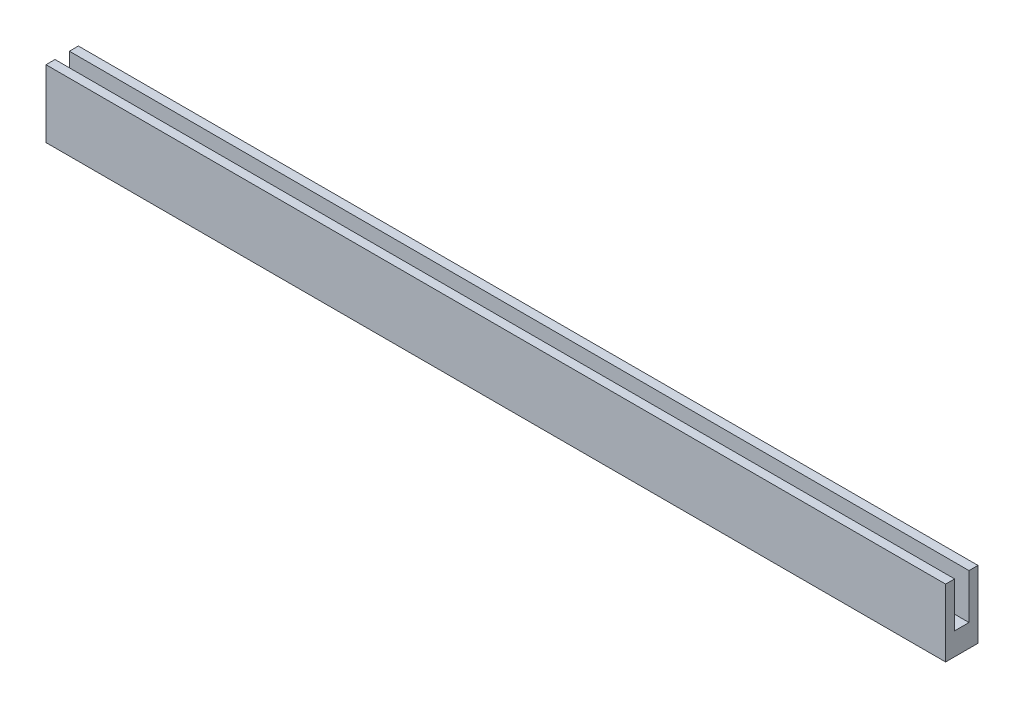
ISO-10303-21;
HEADER;
FILE_DESCRIPTION(('STEP AP214'),'2;1');
FILE_NAME('part.step','',(''),(''),'','','');
FILE_SCHEMA(('AUTOMOTIVE_DESIGN { 1 0 10303 214 1 1 1 1 }'));
ENDSEC;
DATA;
#1=APPLICATION_CONTEXT('core data for automotive mechanical design processes');
#2=APPLICATION_PROTOCOL_DEFINITION('international standard','automotive_design',2000,#1);
#3=PRODUCT_CONTEXT('',#1,'mechanical');
#4=PRODUCT('Part','Part','',(#3));
#5=PRODUCT_RELATED_PRODUCT_CATEGORY('part','',(#4));
#6=PRODUCT_DEFINITION_FORMATION('','',#4);
#7=PRODUCT_DEFINITION_CONTEXT('part definition',#1,'design');
#8=PRODUCT_DEFINITION('design','',#6,#7);
#9=PRODUCT_DEFINITION_SHAPE('','',#8);
#10=(LENGTH_UNIT() NAMED_UNIT(*) SI_UNIT(.MILLI.,.METRE.));
#11=(NAMED_UNIT(*) PLANE_ANGLE_UNIT() SI_UNIT($,.RADIAN.));
#12=(NAMED_UNIT(*) SI_UNIT($,.STERADIAN.) SOLID_ANGLE_UNIT());
#13=UNCERTAINTY_MEASURE_WITH_UNIT(LENGTH_MEASURE(1.E-05),#10,'distance_accuracy_value','');
#14=(GEOMETRIC_REPRESENTATION_CONTEXT(3) GLOBAL_UNCERTAINTY_ASSIGNED_CONTEXT((#13)) GLOBAL_UNIT_ASSIGNED_CONTEXT((#10,
#11,#12)) REPRESENTATION_CONTEXT('',''));
#15=CARTESIAN_POINT('',(0.,0.,0.));
#16=DIRECTION('',(0.,0.,1.));
#17=DIRECTION('',(1.,0.,0.));
#18=AXIS2_PLACEMENT_3D('',#15,#16,#17);
#19=CARTESIAN_POINT('',(200.,0.,0.));
#20=DIRECTION('',(0.,-1.,0.));
#21=DIRECTION('',(0.,0.,-1.));
#22=AXIS2_PLACEMENT_3D('',#19,#20,#21);
#23=PLANE('',#22);
#24=DIRECTION('',(0.,0.,1.));
#25=VECTOR('',#24,1.);
#26=CARTESIAN_POINT('',(0.,0.,0.));
#27=LINE('',#26,#25);
#28=CARTESIAN_POINT('',(0.,0.,0.));
#29=VERTEX_POINT('',#28);
#30=CARTESIAN_POINT('',(0.,0.,7.20000000000001));
#31=VERTEX_POINT('',#30);
#32=EDGE_CURVE('E127',#29,#31,#27,.T.);
#33=ORIENTED_EDGE('',*,*,#32,.F.);
#34=DIRECTION('',(-1.,0.,0.));
#35=VECTOR('',#34,1.);
#36=CARTESIAN_POINT('',(200.,0.,0.));
#37=LINE('',#36,#35);
#38=CARTESIAN_POINT('',(200.,0.,0.));
#39=VERTEX_POINT('',#38);
#40=EDGE_CURVE('E12',#39,#29,#37,.T.);
#41=ORIENTED_EDGE('',*,*,#40,.F.);
#42=DIRECTION('',(0.,0.,1.));
#43=VECTOR('',#42,1.);
#44=CARTESIAN_POINT('',(200.,0.,0.));
#45=LINE('',#44,#43);
#46=CARTESIAN_POINT('',(200.,0.,7.20000000000001));
#47=VERTEX_POINT('',#46);
#48=EDGE_CURVE('E147',#39,#47,#45,.T.);
#49=ORIENTED_EDGE('',*,*,#48,.T.);
#50=DIRECTION('',(-1.,0.,0.));
#51=VECTOR('',#50,1.);
#52=CARTESIAN_POINT('',(200.,0.,7.20000000000001));
#53=LINE('',#52,#51);
#54=EDGE_CURVE('E50',#47,#31,#53,.T.);
#55=ORIENTED_EDGE('',*,*,#54,.T.);
#56=EDGE_LOOP('',(#33,#41,#49,#55));
#57=FACE_BOUND('',#56,.T.);
#58=ADVANCED_FACE('F34',(#57),#23,.T.);
#59=CARTESIAN_POINT('',(200.,0.,0.));
#60=DIRECTION('',(0.,0.,-1.));
#61=DIRECTION('',(-1.,0.,0.));
#62=AXIS2_PLACEMENT_3D('',#59,#60,#61);
#63=PLANE('',#62);
#64=DIRECTION('',(0.,-1.,0.));
#65=VECTOR('',#64,1.);
#66=CARTESIAN_POINT('',(0.,0.,0.));
#67=LINE('',#66,#65);
#68=CARTESIAN_POINT('',(0.,15.,0.));
#69=VERTEX_POINT('',#68);
#70=EDGE_CURVE('E129',#69,#29,#67,.T.);
#71=ORIENTED_EDGE('',*,*,#70,.F.);
#72=DIRECTION('',(-1.,0.,0.));
#73=VECTOR('',#72,1.);
#74=CARTESIAN_POINT('',(200.,15.,0.));
#75=LINE('',#74,#73);
#76=CARTESIAN_POINT('',(200.,15.,0.));
#77=VERTEX_POINT('',#76);
#78=EDGE_CURVE('E42',#77,#69,#75,.T.);
#79=ORIENTED_EDGE('',*,*,#78,.F.);
#80=DIRECTION('',(0.,-1.,0.));
#81=VECTOR('',#80,1.);
#82=CARTESIAN_POINT('',(200.,0.,0.));
#83=LINE('',#82,#81);
#84=EDGE_CURVE('E173',#77,#39,#83,.T.);
#85=ORIENTED_EDGE('',*,*,#84,.T.);
#86=ORIENTED_EDGE('',*,*,#40,.T.);
#87=EDGE_LOOP('',(#71,#79,#85,#86));
#88=FACE_BOUND('',#87,.T.);
#89=ADVANCED_FACE('F164',(#88),#63,.T.);
#90=CARTESIAN_POINT('',(200.,15.,0.));
#91=DIRECTION('',(0.,1.,0.));
#92=DIRECTION('',(0.,0.,1.));
#93=AXIS2_PLACEMENT_3D('',#90,#91,#92);
#94=PLANE('',#93);
#95=DIRECTION('',(0.,0.,-1.));
#96=VECTOR('',#95,1.);
#97=CARTESIAN_POINT('',(0.,15.,0.));
#98=LINE('',#97,#96);
#99=CARTESIAN_POINT('',(0.,15.,2.));
#100=VERTEX_POINT('',#99);
#101=EDGE_CURVE('E132',#100,#69,#98,.T.);
#102=ORIENTED_EDGE('',*,*,#101,.F.);
#103=DIRECTION('',(-1.,0.,0.));
#104=VECTOR('',#103,1.);
#105=CARTESIAN_POINT('',(200.,15.,2.));
#106=LINE('',#105,#104);
#107=CARTESIAN_POINT('',(200.,15.,2.));
#108=VERTEX_POINT('',#107);
#109=EDGE_CURVE('E153',#108,#100,#106,.T.);
#110=ORIENTED_EDGE('',*,*,#109,.F.);
#111=DIRECTION('',(0.,0.,-1.));
#112=VECTOR('',#111,1.);
#113=CARTESIAN_POINT('',(200.,15.,0.));
#114=LINE('',#113,#112);
#115=EDGE_CURVE('E160',#108,#77,#114,.T.);
#116=ORIENTED_EDGE('',*,*,#115,.T.);
#117=ORIENTED_EDGE('',*,*,#78,.T.);
#118=EDGE_LOOP('',(#102,#110,#116,#117));
#119=FACE_BOUND('',#118,.T.);
#120=ADVANCED_FACE('F158',(#119),#94,.T.);
#121=CARTESIAN_POINT('',(200.,0.,2.));
#122=DIRECTION('',(0.,0.,1.));
#123=DIRECTION('',(1.,0.,0.));
#124=AXIS2_PLACEMENT_3D('',#121,#122,#123);
#125=PLANE('',#124);
#126=DIRECTION('',(0.,1.,0.));
#127=VECTOR('',#126,1.);
#128=CARTESIAN_POINT('',(0.,0.,2.));
#129=LINE('',#128,#127);
#130=CARTESIAN_POINT('',(0.,4.99999999999999,2.));
#131=VERTEX_POINT('',#130);
#132=EDGE_CURVE('E135',#131,#100,#129,.T.);
#133=ORIENTED_EDGE('',*,*,#132,.F.);
#134=DIRECTION('',(-1.,0.,0.));
#135=VECTOR('',#134,1.);
#136=CARTESIAN_POINT('',(200.,4.99999999999999,2.));
#137=LINE('',#136,#135);
#138=CARTESIAN_POINT('',(200.,4.99999999999999,2.));
#139=VERTEX_POINT('',#138);
#140=EDGE_CURVE('E151',#139,#131,#137,.T.);
#141=ORIENTED_EDGE('',*,*,#140,.F.);
#142=DIRECTION('',(0.,1.,0.));
#143=VECTOR('',#142,1.);
#144=CARTESIAN_POINT('',(200.,0.,2.));
#145=LINE('',#144,#143);
#146=EDGE_CURVE('E172',#139,#108,#145,.T.);
#147=ORIENTED_EDGE('',*,*,#146,.T.);
#148=ORIENTED_EDGE('',*,*,#109,.T.);
#149=EDGE_LOOP('',(#133,#141,#147,#148));
#150=FACE_BOUND('',#149,.T.);
#151=ADVANCED_FACE('F170',(#150),#125,.T.);
#152=CARTESIAN_POINT('',(200.,4.99999999999999,0.));
#153=DIRECTION('',(0.,1.,0.));
#154=DIRECTION('',(0.,0.,1.));
#155=AXIS2_PLACEMENT_3D('',#152,#153,#154);
#156=PLANE('',#155);
#157=DIRECTION('',(0.,0.,-1.));
#158=VECTOR('',#157,1.);
#159=CARTESIAN_POINT('',(0.,4.99999999999999,0.));
#160=LINE('',#159,#158);
#161=CARTESIAN_POINT('',(0.,4.99999999999999,5.2));
#162=VERTEX_POINT('',#161);
#163=EDGE_CURVE('E138',#162,#131,#160,.T.);
#164=ORIENTED_EDGE('',*,*,#163,.F.);
#165=DIRECTION('',(-1.,0.,0.));
#166=VECTOR('',#165,1.);
#167=CARTESIAN_POINT('',(200.,4.99999999999999,5.2));
#168=LINE('',#167,#166);
#169=CARTESIAN_POINT('',(200.,4.99999999999999,5.2));
#170=VERTEX_POINT('',#169);
#171=EDGE_CURVE('E109',#170,#162,#168,.T.);
#172=ORIENTED_EDGE('',*,*,#171,.F.);
#173=DIRECTION('',(0.,0.,-1.));
#174=VECTOR('',#173,1.);
#175=CARTESIAN_POINT('',(200.,4.99999999999999,0.));
#176=LINE('',#175,#174);
#177=EDGE_CURVE('E119',#170,#139,#176,.T.);
#178=ORIENTED_EDGE('',*,*,#177,.T.);
#179=ORIENTED_EDGE('',*,*,#140,.T.);
#180=EDGE_LOOP('',(#164,#172,#178,#179));
#181=FACE_BOUND('',#180,.T.);
#182=ADVANCED_FACE('F179',(#181),#156,.T.);
#183=CARTESIAN_POINT('',(200.,0.,5.2));
#184=DIRECTION('',(0.,0.,-1.));
#185=DIRECTION('',(0.,1.,0.));
#186=AXIS2_PLACEMENT_3D('',#183,#184,#185);
#187=PLANE('',#186);
#188=DIRECTION('',(0.,-1.,0.));
#189=VECTOR('',#188,1.);
#190=CARTESIAN_POINT('',(0.,0.,5.2));
#191=LINE('',#190,#189);
#192=CARTESIAN_POINT('',(0.,15.,5.20000000000001));
#193=VERTEX_POINT('',#192);
#194=EDGE_CURVE('E105',#193,#162,#191,.T.);
#195=ORIENTED_EDGE('',*,*,#194,.F.);
#196=DIRECTION('',(-1.,0.,0.));
#197=VECTOR('',#196,1.);
#198=CARTESIAN_POINT('',(200.,15.,5.20000000000001));
#199=LINE('',#198,#197);
#200=CARTESIAN_POINT('',(200.,15.,5.20000000000001));
#201=VERTEX_POINT('',#200);
#202=EDGE_CURVE('E100',#201,#193,#199,.T.);
#203=ORIENTED_EDGE('',*,*,#202,.F.);
#204=DIRECTION('',(0.,-1.,0.));
#205=VECTOR('',#204,1.);
#206=CARTESIAN_POINT('',(200.,0.,5.2));
#207=LINE('',#206,#205);
#208=EDGE_CURVE('E103',#201,#170,#207,.T.);
#209=ORIENTED_EDGE('',*,*,#208,.T.);
#210=ORIENTED_EDGE('',*,*,#171,.T.);
#211=EDGE_LOOP('',(#195,#203,#209,#210));
#212=FACE_BOUND('',#211,.T.);
#213=ADVANCED_FACE('F102',(#212),#187,.T.);
#214=CARTESIAN_POINT('',(200.,15.,0.));
#215=DIRECTION('',(0.,1.,0.));
#216=DIRECTION('',(0.,0.,1.));
#217=AXIS2_PLACEMENT_3D('',#214,#215,#216);
#218=PLANE('',#217);
#219=DIRECTION('',(0.,0.,-1.));
#220=VECTOR('',#219,1.);
#221=CARTESIAN_POINT('',(0.,15.,0.));
#222=LINE('',#221,#220);
#223=CARTESIAN_POINT('',(0.,15.,7.20000000000001));
#224=VERTEX_POINT('',#223);
#225=EDGE_CURVE('E142',#224,#193,#222,.T.);
#226=ORIENTED_EDGE('',*,*,#225,.F.);
#227=DIRECTION('',(-1.,0.,0.));
#228=VECTOR('',#227,1.);
#229=CARTESIAN_POINT('',(200.,15.,7.20000000000001));
#230=LINE('',#229,#228);
#231=CARTESIAN_POINT('',(200.,15.,7.20000000000001));
#232=VERTEX_POINT('',#231);
#233=EDGE_CURVE('E75',#232,#224,#230,.T.);
#234=ORIENTED_EDGE('',*,*,#233,.F.);
#235=DIRECTION('',(0.,0.,-1.));
#236=VECTOR('',#235,1.);
#237=CARTESIAN_POINT('',(200.,15.,0.));
#238=LINE('',#237,#236);
#239=EDGE_CURVE('E116',#232,#201,#238,.T.);
#240=ORIENTED_EDGE('',*,*,#239,.T.);
#241=ORIENTED_EDGE('',*,*,#202,.T.);
#242=EDGE_LOOP('',(#226,#234,#240,#241));
#243=FACE_BOUND('',#242,.T.);
#244=ADVANCED_FACE('F121',(#243),#218,.T.);
#245=CARTESIAN_POINT('',(200.,0.,7.20000000000001));
#246=DIRECTION('',(0.,0.,1.));
#247=DIRECTION('',(1.,0.,0.));
#248=AXIS2_PLACEMENT_3D('',#245,#246,#247);
#249=PLANE('',#248);
#250=DIRECTION('',(0.,1.,0.));
#251=VECTOR('',#250,1.);
#252=CARTESIAN_POINT('',(0.,0.,7.20000000000001));
#253=LINE('',#252,#251);
#254=EDGE_CURVE('E144',#31,#224,#253,.T.);
#255=ORIENTED_EDGE('',*,*,#254,.F.);
#256=ORIENTED_EDGE('',*,*,#54,.F.);
#257=DIRECTION('',(0.,1.,0.));
#258=VECTOR('',#257,1.);
#259=CARTESIAN_POINT('',(200.,0.,7.20000000000001));
#260=LINE('',#259,#258);
#261=EDGE_CURVE('E122',#47,#232,#260,.T.);
#262=ORIENTED_EDGE('',*,*,#261,.T.);
#263=ORIENTED_EDGE('',*,*,#233,.T.);
#264=EDGE_LOOP('',(#255,#256,#262,#263));
#265=FACE_BOUND('',#264,.T.);
#266=ADVANCED_FACE('F180',(#265),#249,.T.);
#267=CARTESIAN_POINT('',(200.,0.,0.));
#268=DIRECTION('',(1.,0.,0.));
#269=DIRECTION('',(0.,0.,-1.));
#270=AXIS2_PLACEMENT_3D('',#267,#268,#269);
#271=PLANE('',#270);
#272=ORIENTED_EDGE('',*,*,#48,.F.);
#273=ORIENTED_EDGE('',*,*,#84,.F.);
#274=ORIENTED_EDGE('',*,*,#115,.F.);
#275=ORIENTED_EDGE('',*,*,#146,.F.);
#276=ORIENTED_EDGE('',*,*,#177,.F.);
#277=ORIENTED_EDGE('',*,*,#208,.F.);
#278=ORIENTED_EDGE('',*,*,#239,.F.);
#279=ORIENTED_EDGE('',*,*,#261,.F.);
#280=EDGE_LOOP('',(#272,#273,#274,#275,#276,#277,#278,#279));
#281=FACE_BOUND('',#280,.T.);
#282=ADVANCED_FACE('F114',(#281),#271,.T.);
#283=CARTESIAN_POINT('',(0.,0.,0.));
#284=DIRECTION('',(1.,0.,0.));
#285=DIRECTION('',(0.,0.,-1.));
#286=AXIS2_PLACEMENT_3D('',#283,#284,#285);
#287=PLANE('',#286);
#288=ORIENTED_EDGE('',*,*,#32,.T.);
#289=ORIENTED_EDGE('',*,*,#254,.T.);
#290=ORIENTED_EDGE('',*,*,#225,.T.);
#291=ORIENTED_EDGE('',*,*,#194,.T.);
#292=ORIENTED_EDGE('',*,*,#163,.T.);
#293=ORIENTED_EDGE('',*,*,#132,.T.);
#294=ORIENTED_EDGE('',*,*,#101,.T.);
#295=ORIENTED_EDGE('',*,*,#70,.T.);
#296=EDGE_LOOP('',(#288,#289,#290,#291,#292,#293,#294,#295));
#297=FACE_BOUND('',#296,.T.);
#298=ADVANCED_FACE('F166',(#297),#287,.F.);
#299=CLOSED_SHELL('',(#58,#89,#120,#151,#182,#213,#244,#266,#282,#298));
#300=MANIFOLD_SOLID_BREP('B2',#299);
#301=ADVANCED_BREP_SHAPE_REPRESENTATION('',(#18,#300),#14);
#302=SHAPE_DEFINITION_REPRESENTATION(#9,#301);
ENDSEC;
END-ISO-10303-21;
